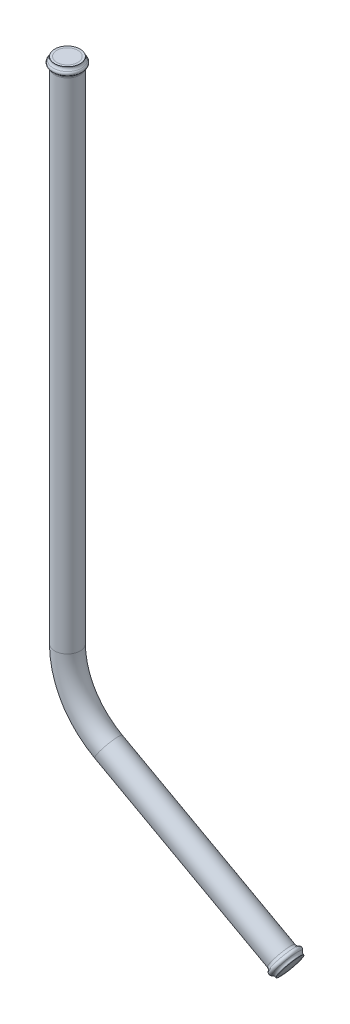
ISO-10303-21;
HEADER;
FILE_DESCRIPTION(('STEP AP214'),'2;1');
FILE_NAME('part.step','',(''),(''),'','','');
FILE_SCHEMA(('AUTOMOTIVE_DESIGN { 1 0 10303 214 1 1 1 1 }'));
ENDSEC;
DATA;
#1=APPLICATION_CONTEXT('core data for automotive mechanical design processes');
#2=APPLICATION_PROTOCOL_DEFINITION('international standard','automotive_design',2000,#1);
#3=PRODUCT_CONTEXT('',#1,'mechanical');
#4=PRODUCT('Part','Part','',(#3));
#5=PRODUCT_RELATED_PRODUCT_CATEGORY('part','',(#4));
#6=PRODUCT_DEFINITION_FORMATION('','',#4);
#7=PRODUCT_DEFINITION_CONTEXT('part definition',#1,'design');
#8=PRODUCT_DEFINITION('design','',#6,#7);
#9=PRODUCT_DEFINITION_SHAPE('','',#8);
#10=(LENGTH_UNIT() NAMED_UNIT(*) SI_UNIT(.MILLI.,.METRE.));
#11=(NAMED_UNIT(*) PLANE_ANGLE_UNIT() SI_UNIT($,.RADIAN.));
#12=(NAMED_UNIT(*) SI_UNIT($,.STERADIAN.) SOLID_ANGLE_UNIT());
#13=UNCERTAINTY_MEASURE_WITH_UNIT(LENGTH_MEASURE(1.E-05),#10,'distance_accuracy_value','');
#14=(GEOMETRIC_REPRESENTATION_CONTEXT(3) GLOBAL_UNCERTAINTY_ASSIGNED_CONTEXT((#13)) GLOBAL_UNIT_ASSIGNED_CONTEXT((#10,
#11,#12)) REPRESENTATION_CONTEXT('',''));
#15=CARTESIAN_POINT('',(0.,0.,0.));
#16=DIRECTION('',(0.,0.,1.));
#17=DIRECTION('',(1.,0.,0.));
#18=AXIS2_PLACEMENT_3D('',#15,#16,#17);
#19=CARTESIAN_POINT('',(407.593134312898,-255.195792787069,307.283767943784));
#20=DIRECTION('',(0.837825093808645,-0.543268611001303,-0.0539289206757398));
#21=DIRECTION('',(0.544060340165077,0.839046093048207,0.));
#22=AXIS2_PLACEMENT_3D('',#19,#20,#21);
#23=CYLINDRICAL_SURFACE('',#22,9.52499999999997);
#24=CARTESIAN_POINT('',(535.011185448498,-337.8171276796,299.082153999384));
#25=DIRECTION('',(0.837825093808641,-0.543268611001309,-0.0539289206757388));
#26=DIRECTION('',(0.544060340165084,0.839046093048203,0.));
#27=AXIS2_PLACEMENT_3D('',#24,#25,#26);
#28=CIRCLE('',#27,9.52499999999997);
#29=CARTESIAN_POINT('',(540.19336018857,-329.825213643316,299.082153999384));
#30=VERTEX_POINT('',#29);
#31=EDGE_CURVE('E13',#30,#30,#28,.T.);
#32=CARTESIAN_POINT('',(535.277678609336,-337.989929103668,299.065000432801));
#33=DIRECTION('',(-0.837825093808644,0.543268611001304,0.0539289206757395));
#34=DIRECTION('',(-0.544060340165078,-0.839046093048206,0.));
#35=AXIS2_PLACEMENT_3D('',#32,#33,#34);
#36=CIRCLE('',#35,9.52499999999997);
#37=CARTESIAN_POINT('',(540.459853349408,-329.998015067384,299.065000432801));
#38=VERTEX_POINT('',#37);
#39=EDGE_CURVE('E118',#38,#38,#36,.T.);
#40=CARTESIAN_POINT('',(540.19336018857,-329.825213643316,299.082153999384));
#41=CARTESIAN_POINT('',(540.196136158996,-329.82701365815,299.081975316399));
#42=CARTESIAN_POINT('',(540.198912129421,-329.828813672984,299.081796633413));
#43=CARTESIAN_POINT('',(540.204464070272,-329.832413702652,299.081439267443));
#44=CARTESIAN_POINT('',(540.207240040697,-329.834213717486,299.081260584458));
#45=CARTESIAN_POINT('',(540.212791981548,-329.837813747154,299.080903218487));
#46=CARTESIAN_POINT('',(540.215567951973,-329.839613761988,299.080724535502));
#47=CARTESIAN_POINT('',(540.221119892824,-329.843213791656,299.080367169531));
#48=CARTESIAN_POINT('',(540.223895863249,-329.845013806491,299.080188486546));
#49=CARTESIAN_POINT('',(540.2294478041,-329.848613836159,299.079831120576));
#50=CARTESIAN_POINT('',(540.232223774526,-329.850413850993,299.07965243759));
#51=CARTESIAN_POINT('',(540.237775715376,-329.854013880661,299.07929507162));
#52=CARTESIAN_POINT('',(540.240551685802,-329.855813895495,299.079116388635));
#53=CARTESIAN_POINT('',(540.246103626653,-329.859413925163,299.078759022664));
#54=CARTESIAN_POINT('',(540.248879597078,-329.861213939997,299.078580339679));
#55=CARTESIAN_POINT('',(540.254431537929,-329.864813969665,299.078222973709));
#56=CARTESIAN_POINT('',(540.257207508354,-329.866613984499,299.078044290723));
#57=CARTESIAN_POINT('',(540.262759449205,-329.870214014167,299.077686924753));
#58=CARTESIAN_POINT('',(540.26553541963,-329.872014029001,299.077508241768));
#59=CARTESIAN_POINT('',(540.271087360481,-329.875614058669,299.077150875797));
#60=CARTESIAN_POINT('',(540.273863330907,-329.877414073503,299.076972192812));
#61=CARTESIAN_POINT('',(540.279415271757,-329.881014103171,299.076614826841));
#62=CARTESIAN_POINT('',(540.282191242183,-329.882814118005,299.076436143856));
#63=CARTESIAN_POINT('',(540.287743183034,-329.886414147673,299.076078777886));
#64=CARTESIAN_POINT('',(540.290519153459,-329.888214162507,299.0759000949));
#65=CARTESIAN_POINT('',(540.29607109431,-329.891814192176,299.07554272893));
#66=CARTESIAN_POINT('',(540.298847064735,-329.89361420701,299.075364045945));
#67=CARTESIAN_POINT('',(540.304399005586,-329.897214236678,299.075006679974));
#68=CARTESIAN_POINT('',(540.307174976011,-329.899014251512,299.074827996989));
#69=CARTESIAN_POINT('',(540.312726916862,-329.90261428118,299.074470631019));
#70=CARTESIAN_POINT('',(540.315502887288,-329.904414296014,299.074291948033));
#71=CARTESIAN_POINT('',(540.321054828138,-329.908014325682,299.073934582063));
#72=CARTESIAN_POINT('',(540.323830798564,-329.909814340516,299.073755899078));
#73=CARTESIAN_POINT('',(540.329382739415,-329.913414370184,299.073398533107));
#74=CARTESIAN_POINT('',(540.33215870984,-329.915214385018,299.073219850122));
#75=CARTESIAN_POINT('',(540.337710650691,-329.918814414686,299.072862484151));
#76=CARTESIAN_POINT('',(540.340486621116,-329.92061442952,299.072683801166));
#77=CARTESIAN_POINT('',(540.346038561967,-329.924214459188,299.072326435196));
#78=CARTESIAN_POINT('',(540.348814532392,-329.926014474022,299.07214775221));
#79=CARTESIAN_POINT('',(540.354366473243,-329.92961450369,299.07179038624));
#80=CARTESIAN_POINT('',(540.357142443669,-329.931414518524,299.071611703255));
#81=CARTESIAN_POINT('',(540.362694384519,-329.935014548192,299.071254337284));
#82=CARTESIAN_POINT('',(540.365470354945,-329.936814563027,299.071075654299));
#83=CARTESIAN_POINT('',(540.371022295795,-329.940414592695,299.070718288329));
#84=CARTESIAN_POINT('',(540.373798266221,-329.942214607529,299.070539605343));
#85=CARTESIAN_POINT('',(540.379350207072,-329.945814637197,299.070182239373));
#86=CARTESIAN_POINT('',(540.382126177497,-329.947614652031,299.070003556388));
#87=CARTESIAN_POINT('',(540.387678118348,-329.951214681699,299.069646190417));
#88=CARTESIAN_POINT('',(540.390454088773,-329.953014696533,299.069467507432));
#89=CARTESIAN_POINT('',(540.396006029624,-329.956614726201,299.069110141461));
#90=CARTESIAN_POINT('',(540.398782000049,-329.958414741035,299.068931458476));
#91=CARTESIAN_POINT('',(540.4043339409,-329.962014770703,299.068574092506));
#92=CARTESIAN_POINT('',(540.407109911326,-329.963814785537,299.06839540952));
#93=CARTESIAN_POINT('',(540.412661852176,-329.967414815205,299.06803804355));
#94=CARTESIAN_POINT('',(540.415437822602,-329.969214830039,299.067859360565));
#95=CARTESIAN_POINT('',(540.420989763453,-329.972814859707,299.067501994594));
#96=CARTESIAN_POINT('',(540.423765733878,-329.974614874541,299.067323311609));
#97=CARTESIAN_POINT('',(540.429317674729,-329.978214904209,299.066965945639));
#98=CARTESIAN_POINT('',(540.432093645154,-329.980014919043,299.066787262653));
#99=CARTESIAN_POINT('',(540.437645586005,-329.983614948712,299.066429896683));
#100=CARTESIAN_POINT('',(540.44042155643,-329.985414963546,299.066251213698));
#101=CARTESIAN_POINT('',(540.445973497281,-329.989014993214,299.065893847727));
#102=CARTESIAN_POINT('',(540.448749467707,-329.990815008048,299.065715164742));
#103=CARTESIAN_POINT('',(540.454301408557,-329.994415037716,299.065357798771));
#104=CARTESIAN_POINT('',(540.457077378983,-329.99621505255,299.065179115786));
#105=CARTESIAN_POINT('',(540.459853349408,-329.998015067384,299.065000432801));
#106=B_SPLINE_CURVE_WITH_KNOTS('',3,(#40,#41,#42,#43,#44,#45,#46,#47,#48,#49,#50,#51,#52,#53,
#54,#55,#56,#57,#58,#59,#60,#61,#62,#63,#64,#65,#66,#67,#68,#69,#70,#71,#72,#73,#74,#75,#76,#77,
#78,#79,#80,#81,#82,#83,#84,#85,#86,#87,#88,#89,#90,#91,#92,#93,#94,#95,#96,#97,#98,#99,#100,
#101,#102,#103,#104,#105),.UNSPECIFIED.,.F.,.F.,(4,2,2,2,2,2,2,2,2,2,2,2,2,2,2,2,2,2,2,2,2,2,2,
2,2,2,2,2,2,2,2,2,4),(0.,0.00993991626390516,0.0198798325276871,0.0298197487914661,
0.0397596650553411,0.0496995813191231,0.0596394975829981,0.0695794138467801,0.0795193301106551,
0.0894592463744643,0.0993991626383393,0.109339078902121,0.119278995165903,0.129218911429778,
0.139158827693653,0.149098743957435,0.159038660221214,0.168978576485089,0.178918492748871,
0.188858409012746,0.198798325276528,0.20873824154031,0.218678157804185,0.228618074068057,
0.238557990331869,0.248497906595651,0.258437822859526,0.268377739123308,0.278317655387183,
0.288257571650962,0.298197487914744,0.308137404178619,0.318077320442525),.UNSPECIFIED.);
#107=EDGE_CURVE('BSEAM73',#30,#38,#106,.T.);
#108=ORIENTED_EDGE('',*,*,#31,.T.);
#109=ORIENTED_EDGE('',*,*,#39,.T.);
#110=ORIENTED_EDGE('',*,*,#107,.T.);
#111=ORIENTED_EDGE('',*,*,#107,.F.);
#112=EDGE_LOOP('',(#108,#110,#109,#111));
#113=FACE_BOUND('',#112,.T.);
#114=ADVANCED_FACE('F73',(#113),#23,.T.);
#115=CARTESIAN_POINT('',(378.65058663225,179.1162,309.14673477249));
#116=DIRECTION('',(0.,-1.,0.));
#117=DIRECTION('',(0.,0.,-1.));
#118=AXIS2_PLACEMENT_3D('',#115,#116,#117);
#119=CYLINDRICAL_SURFACE('',#118,9.52499999999997);
#120=CARTESIAN_POINT('',(378.65058663225,178.798122679556,309.14673477249));
#121=DIRECTION('',(0.,1.,0.));
#122=DIRECTION('',(0.,0.,1.));
#123=AXIS2_PLACEMENT_3D('',#120,#121,#122);
#124=CIRCLE('',#123,9.52499999999997);
#125=CARTESIAN_POINT('',(378.65058663225,178.798122679556,318.67173477249));
#126=VERTEX_POINT('',#125);
#127=EDGE_CURVE('E102',#126,#126,#124,.T.);
#128=ORIENTED_EDGE('',*,*,#127,.T.);
#129=EDGE_LOOP('',(#128));
#130=FACE_BOUND('',#129,.T.);
#131=CARTESIAN_POINT('',(378.65058663225,179.1162,309.14673477249));
#132=DIRECTION('',(0.,1.,0.));
#133=DIRECTION('',(-0.999570072305478,0.,0.0293201390041424));
#134=AXIS2_PLACEMENT_3D('',#131,#132,#133);
#135=CIRCLE('',#134,9.52499999999997);
#136=CARTESIAN_POINT('',(369.129681693541,179.1162,309.426009096505));
#137=VERTEX_POINT('',#136);
#138=EDGE_CURVE('E114',#137,#137,#135,.T.);
#139=ORIENTED_EDGE('',*,*,#138,.F.);
#140=EDGE_LOOP('',(#139));
#141=FACE_BOUND('',#140,.T.);
#142=ADVANCED_FACE('F144',(#130,#141),#119,.T.);
#143=CARTESIAN_POINT('',(378.650586632251,182.9262,309.14673477249));
#144=DIRECTION('',(0.,-1.,0.));
#145=DIRECTION('',(0.,0.,-1.));
#146=AXIS2_PLACEMENT_3D('',#143,#144,#145);
#147=CYLINDRICAL_SURFACE('',#146,7.85000000000002);
#148=CARTESIAN_POINT('',(378.650586632251,179.1162,309.14673477249));
#149=DIRECTION('',(0.,1.,0.));
#150=DIRECTION('',(0.,0.,1.));
#151=AXIS2_PLACEMENT_3D('',#148,#149,#150);
#152=CIRCLE('',#151,7.85000000000002);
#153=CARTESIAN_POINT('',(378.650586632251,179.1162,316.99673477249));
#154=VERTEX_POINT('',#153);
#155=EDGE_CURVE('E115',#154,#154,#152,.T.);
#156=ORIENTED_EDGE('',*,*,#155,.T.);
#157=EDGE_LOOP('',(#156));
#158=FACE_BOUND('',#157,.T.);
#159=CARTESIAN_POINT('',(378.650586632251,-201.8838,309.14673477249));
#160=DIRECTION('',(0.,1.,0.));
#161=DIRECTION('',(-0.999570072305477,0.,0.0293201390041424));
#162=AXIS2_PLACEMENT_3D('',#159,#160,#161);
#163=CIRCLE('',#162,7.85000000000002);
#164=CARTESIAN_POINT('',(370.816798364303,-201.8838,309.650978139292));
#165=VERTEX_POINT('',#164);
#166=EDGE_CURVE('E105',#165,#165,#163,.T.);
#167=ORIENTED_EDGE('',*,*,#166,.F.);
#168=EDGE_LOOP('',(#167));
#169=FACE_BOUND('',#168,.T.);
#170=ADVANCED_FACE('F152',(#158,#169),#147,.F.);
#171=CARTESIAN_POINT('',(407.593134312899,-255.195792787065,307.283767943786));
#172=DIRECTION('',(0.837825093808645,-0.543268611001303,-0.0539289206757397));
#173=DIRECTION('',(0.544060340165078,0.839046093048207,0.));
#174=AXIS2_PLACEMENT_3D('',#171,#172,#173);
#175=CYLINDRICAL_SURFACE('',#174,7.85000000000002);
#176=CARTESIAN_POINT('',(407.593134312899,-255.195792787065,307.283767943786));
#177=DIRECTION('',(-0.837825093808644,0.543268611001304,0.0539289206757395));
#178=DIRECTION('',(-0.544060340165078,-0.839046093048206,0.));
#179=AXIS2_PLACEMENT_3D('',#176,#177,#178);
#180=CIRCLE('',#179,7.85000000000002);
#181=CARTESIAN_POINT('',(403.337283041691,-261.786330478068,307.557707537275));
#182=VERTEX_POINT('',#181);
#183=EDGE_CURVE('E108',#182,#182,#180,.T.);
#184=ORIENTED_EDGE('',*,*,#183,.T.);
#185=EDGE_LOOP('',(#184));
#186=FACE_BOUND('',#185,.T.);
#187=CARTESIAN_POINT('',(535.277678609338,-337.989929103665,299.065000432803));
#188=DIRECTION('',(-0.837825093808644,0.543268611001304,0.0539289206757395));
#189=DIRECTION('',(-0.544060340165078,-0.839046093048206,0.));
#190=AXIS2_PLACEMENT_3D('',#187,#188,#189);
#191=CIRCLE('',#190,7.85000000000002);
#192=CARTESIAN_POINT('',(531.006804939042,-344.576440934093,299.065000432803));
#193=VERTEX_POINT('',#192);
#194=EDGE_CURVE('E111',#193,#193,#191,.T.);
#195=ORIENTED_EDGE('',*,*,#194,.F.);
#196=EDGE_LOOP('',(#195));
#197=FACE_BOUND('',#196,.T.);
#198=ADVANCED_FACE('F163',(#186,#197),#175,.F.);
#199=CARTESIAN_POINT('',(442.019447143675,-201.8838,305.067823461422));
#200=DIRECTION('',(0.0642348237963485,0.,0.997934811203543));
#201=DIRECTION('',(0.997934811203544,0.,-0.0642348237963486));
#202=AXIS2_PLACEMENT_3D('',#199,#200,#201);
#203=TOROIDAL_SURFACE('',#202,63.4999999999999,7.85000000000002);
#204=CARTESIAN_POINT('',(442.019447143675,-201.8838,305.067823461422));
#205=DIRECTION('',(0.0642348237963485,0.,0.997934811203543));
#206=DIRECTION('',(0.997934811203544,0.,-0.0642348237963486));
#207=AXIS2_PLACEMENT_3D('',#204,#205,#206);
#208=CIRCLE('',#207,71.3499999999999);
#209=EDGE_CURVE('',#165,#182,#208,.T.);
#210=ORIENTED_EDGE('',*,*,#166,.T.);
#211=ORIENTED_EDGE('',*,*,#183,.F.);
#212=ORIENTED_EDGE('',*,*,#209,.T.);
#213=ORIENTED_EDGE('',*,*,#209,.F.);
#214=EDGE_LOOP('',(#210,#212,#211,#213));
#215=FACE_BOUND('',#214,.T.);
#216=ADVANCED_FACE('F158',(#215),#203,.F.);
#217=CARTESIAN_POINT('',(535.277678609336,-337.989929103668,299.065000432801));
#218=DIRECTION('',(-0.837825093808644,0.543268611001304,0.0539289206757395));
#219=DIRECTION('',(-0.544060340165078,-0.839046093048206,0.));
#220=AXIS2_PLACEMENT_3D('',#217,#218,#219);
#221=PLANE('',#220);
#222=ORIENTED_EDGE('',*,*,#194,.T.);
#223=EDGE_LOOP('',(#222));
#224=FACE_BOUND('',#223,.T.);
#225=ORIENTED_EDGE('',*,*,#39,.F.);
#226=EDGE_LOOP('',(#225));
#227=FACE_BOUND('',#226,.T.);
#228=ADVANCED_FACE('F145',(#224,#227),#221,.F.);
#229=CARTESIAN_POINT('',(442.019447143675,-201.8838,305.067823461422));
#230=DIRECTION('',(0.0642348237963485,0.,0.997934811203543));
#231=DIRECTION('',(0.997934811203544,0.,-0.0642348237963486));
#232=AXIS2_PLACEMENT_3D('',#229,#230,#231);
#233=TOROIDAL_SURFACE('',#232,63.5,9.52499999999997);
#234=CARTESIAN_POINT('',(378.65058663225,-201.8838,309.14673477249));
#235=DIRECTION('',(0.,1.,0.));
#236=DIRECTION('',(-0.999570072305478,0.,0.0293201390041424));
#237=AXIS2_PLACEMENT_3D('',#234,#235,#236);
#238=CIRCLE('',#237,9.52499999999997);
#239=CARTESIAN_POINT('',(369.145257555537,-201.8838,309.758571469151));
#240=VERTEX_POINT('',#239);
#241=EDGE_CURVE('E121',#240,#240,#238,.T.);
#242=CARTESIAN_POINT('',(407.593134312899,-255.195792787066,307.283767943785));
#243=DIRECTION('',(-0.837825093808644,0.543268611001304,0.0539289206757395));
#244=DIRECTION('',(-0.544060340165078,-0.839046093048206,0.));
#245=AXIS2_PLACEMENT_3D('',#242,#243,#244);
#246=CIRCLE('',#245,9.52499999999997);
#247=CARTESIAN_POINT('',(402.429187388281,-263.192591705129,307.61615961614));
#248=VERTEX_POINT('',#247);
#249=EDGE_CURVE('E124',#248,#248,#246,.T.);
#250=CARTESIAN_POINT('',(442.019447143675,-201.8838,305.067823461422));
#251=DIRECTION('',(0.0642348237963485,0.,0.997934811203543));
#252=DIRECTION('',(0.997934811203544,0.,-0.0642348237963486));
#253=AXIS2_PLACEMENT_3D('',#250,#251,#252);
#254=CIRCLE('',#253,73.0249999999999);
#255=EDGE_CURVE('',#240,#248,#254,.T.);
#256=ORIENTED_EDGE('',*,*,#241,.F.);
#257=ORIENTED_EDGE('',*,*,#249,.T.);
#258=ORIENTED_EDGE('',*,*,#255,.T.);
#259=ORIENTED_EDGE('',*,*,#255,.F.);
#260=EDGE_LOOP('',(#256,#258,#257,#259));
#261=FACE_BOUND('',#260,.T.);
#262=ADVANCED_FACE('F130',(#261),#233,.T.);
#263=CARTESIAN_POINT('',(529.159944555353,-334.023023711906,299.458785241767));
#264=DIRECTION('',(0.837825093808641,-0.543268611001309,-0.0539289206757388));
#265=DIRECTION('',(0.544060340165084,0.839046093048203,0.));
#266=AXIS2_PLACEMENT_3D('',#263,#264,#265);
#267=CIRCLE('',#266,9.52499999999997);
#268=CARTESIAN_POINT('',(534.342119295425,-326.031109675622,299.458785241767));
#269=VERTEX_POINT('',#268);
#270=EDGE_CURVE('E80',#269,#269,#267,.F.);
#271=ORIENTED_EDGE('',*,*,#270,.T.);
#272=EDGE_LOOP('',(#271));
#273=FACE_BOUND('',#272,.T.);
#274=ORIENTED_EDGE('',*,*,#249,.F.);
#275=EDGE_LOOP('',(#274));
#276=FACE_BOUND('',#275,.T.);
#277=ADVANCED_FACE('F133',(#273,#276),#23,.T.);
#278=CARTESIAN_POINT('',(378.65058663225,171.814277320444,309.14673477249));
#279=DIRECTION('',(0.,1.,0.));
#280=DIRECTION('',(0.,0.,1.));
#281=AXIS2_PLACEMENT_3D('',#278,#279,#280);
#282=CIRCLE('',#281,9.52499999999997);
#283=CARTESIAN_POINT('',(378.65058663225,171.814277320444,318.67173477249));
#284=VERTEX_POINT('',#283);
#285=EDGE_CURVE('E93',#284,#284,#282,.F.);
#286=ORIENTED_EDGE('',*,*,#285,.T.);
#287=EDGE_LOOP('',(#286));
#288=FACE_BOUND('',#287,.T.);
#289=ORIENTED_EDGE('',*,*,#241,.T.);
#290=EDGE_LOOP('',(#289));
#291=FACE_BOUND('',#290,.T.);
#292=ADVANCED_FACE('F135',(#288,#291),#119,.T.);
#293=CARTESIAN_POINT('',(378.65058663225,179.1162,309.14673477249));
#294=DIRECTION('',(0.,1.,0.));
#295=DIRECTION('',(-0.999570072305478,0.,0.0293201390041424));
#296=AXIS2_PLACEMENT_3D('',#293,#294,#295);
#297=PLANE('',#296);
#298=ORIENTED_EDGE('',*,*,#155,.F.);
#299=EDGE_LOOP('',(#298));
#300=FACE_BOUND('',#299,.T.);
#301=ORIENTED_EDGE('',*,*,#138,.T.);
#302=EDGE_LOOP('',(#301));
#303=FACE_BOUND('',#302,.T.);
#304=ADVANCED_FACE('F141',(#300,#303),#297,.T.);
#305=CARTESIAN_POINT('',(378.650586632251,175.3062,309.14673477249));
#306=DIRECTION('',(0.,1.,0.));
#307=DIRECTION('',(0.,0.,1.));
#308=AXIS2_PLACEMENT_3D('',#305,#306,#307);
#309=TOROIDAL_SURFACE('',#308,9.5249999999999,1.778);
#310=CARTESIAN_POINT('',(378.650586632251,176.744050515111,309.14673477249));
#311=DIRECTION('',(0.,-1.,0.));
#312=DIRECTION('',(0.,0.,-1.));
#313=AXIS2_PLACEMENT_3D('',#310,#311,#312);
#314=CIRCLE('',#313,10.5708823529411);
#315=CARTESIAN_POINT('',(378.650586632251,176.744050515111,298.575852419549));
#316=VERTEX_POINT('',#315);
#317=EDGE_CURVE('E96',#316,#316,#314,.T.);
#318=ORIENTED_EDGE('',*,*,#317,.T.);
#319=EDGE_LOOP('',(#318));
#320=FACE_BOUND('',#319,.T.);
#321=CARTESIAN_POINT('',(378.650586632251,173.868349484889,309.14673477249));
#322=DIRECTION('',(0.,1.,0.));
#323=DIRECTION('',(0.,0.,1.));
#324=AXIS2_PLACEMENT_3D('',#321,#322,#323);
#325=CIRCLE('',#324,10.5708823529411);
#326=CARTESIAN_POINT('',(378.650586632251,173.868349484889,319.717617125431));
#327=VERTEX_POINT('',#326);
#328=EDGE_CURVE('E99',#327,#327,#325,.T.);
#329=ORIENTED_EDGE('',*,*,#328,.T.);
#330=EDGE_LOOP('',(#329));
#331=FACE_BOUND('',#330,.T.);
#332=ADVANCED_FACE('F166',(#320,#331),#309,.T.);
#333=CARTESIAN_POINT('',(532.085565001925,-335.920075695754,299.270469620575));
#334=DIRECTION('',(0.837825093808637,-0.543268611001315,-0.0539289206757379));
#335=DIRECTION('',(0.54406034016509,0.839046093048199,0.));
#336=AXIS2_PLACEMENT_3D('',#333,#334,#335);
#337=TOROIDAL_SURFACE('',#336,9.52499999999999,1.77799999999995);
#338=CARTESIAN_POINT('',(530.880897759218,-335.138936643582,299.348011346948));
#339=DIRECTION('',(0.837825093808641,-0.543268611001309,-0.0539289206757388));
#340=DIRECTION('',(0.544060340165084,0.839046093048203,0.));
#341=AXIS2_PLACEMENT_3D('',#338,#339,#340);
#342=CIRCLE('',#341,10.5708823529407);
#343=CARTESIAN_POINT('',(536.632095608004,-326.269479105275,299.348011346948));
#344=VERTEX_POINT('',#343);
#345=EDGE_CURVE('E84',#344,#344,#342,.T.);
#346=ORIENTED_EDGE('',*,*,#345,.T.);
#347=EDGE_LOOP('',(#346));
#348=FACE_BOUND('',#347,.T.);
#349=CARTESIAN_POINT('',(533.290232244631,-336.701214747926,299.192927894202));
#350=DIRECTION('',(-0.837825093808641,0.543268611001309,0.0539289206757388));
#351=DIRECTION('',(-0.544060340165084,-0.839046093048203,0.));
#352=AXIS2_PLACEMENT_3D('',#349,#350,#351);
#353=CIRCLE('',#352,10.5708823529407);
#354=CARTESIAN_POINT('',(527.539034395845,-345.570672286234,299.192927894202));
#355=VERTEX_POINT('',#354);
#356=EDGE_CURVE('E88',#355,#355,#353,.T.);
#357=ORIENTED_EDGE('',*,*,#356,.T.);
#358=EDGE_LOOP('',(#357));
#359=FACE_BOUND('',#358,.T.);
#360=ADVANCED_FACE('F173',(#348,#359),#337,.T.);
#361=CARTESIAN_POINT('',(378.65058663225,178.798122679556,309.14673477249));
#362=DIRECTION('',(0.,1.,0.));
#363=DIRECTION('',(0.,0.,1.));
#364=AXIS2_PLACEMENT_3D('',#361,#362,#363);
#365=TOROIDAL_SURFACE('',#364,12.0649999999999,2.54);
#366=ORIENTED_EDGE('',*,*,#317,.F.);
#367=EDGE_LOOP('',(#366));
#368=FACE_BOUND('',#367,.T.);
#369=ORIENTED_EDGE('',*,*,#127,.F.);
#370=EDGE_LOOP('',(#369));
#371=FACE_BOUND('',#370,.T.);
#372=ADVANCED_FACE('F190',(#368,#371),#365,.F.);
#373=CARTESIAN_POINT('',(378.65058663225,171.814277320444,309.14673477249));
#374=DIRECTION('',(0.,1.,0.));
#375=DIRECTION('',(0.,0.,1.));
#376=AXIS2_PLACEMENT_3D('',#373,#374,#375);
#377=TOROIDAL_SURFACE('',#376,12.0649999999999,2.54);
#378=ORIENTED_EDGE('',*,*,#285,.F.);
#379=EDGE_LOOP('',(#378));
#380=FACE_BOUND('',#379,.T.);
#381=ORIENTED_EDGE('',*,*,#328,.F.);
#382=EDGE_LOOP('',(#381));
#383=FACE_BOUND('',#382,.T.);
#384=ADVANCED_FACE('F194',(#380,#383),#377,.F.);
#385=CARTESIAN_POINT('',(529.159944555352,-334.023023711907,299.458785241767));
#386=DIRECTION('',(0.837825093808641,-0.543268611001309,-0.0539289206757388));
#387=DIRECTION('',(0.544060340165084,0.839046093048203,0.));
#388=AXIS2_PLACEMENT_3D('',#385,#386,#387);
#389=TOROIDAL_SURFACE('',#388,12.0649999999989,2.54);
#390=ORIENTED_EDGE('',*,*,#270,.F.);
#391=EDGE_LOOP('',(#390));
#392=FACE_BOUND('',#391,.T.);
#393=ORIENTED_EDGE('',*,*,#345,.F.);
#394=EDGE_LOOP('',(#393));
#395=FACE_BOUND('',#394,.T.);
#396=ADVANCED_FACE('F197',(#392,#395),#389,.F.);
#397=CARTESIAN_POINT('',(535.011185448497,-337.817127679601,299.082153999384));
#398=DIRECTION('',(0.837825093808641,-0.543268611001309,-0.0539289206757388));
#399=DIRECTION('',(0.544060340165084,0.839046093048203,0.));
#400=AXIS2_PLACEMENT_3D('',#397,#398,#399);
#401=TOROIDAL_SURFACE('',#400,12.0649999999989,2.54);
#402=ORIENTED_EDGE('',*,*,#356,.F.);
#403=EDGE_LOOP('',(#402));
#404=FACE_BOUND('',#403,.T.);
#405=ORIENTED_EDGE('',*,*,#31,.F.);
#406=EDGE_LOOP('',(#405));
#407=FACE_BOUND('',#406,.T.);
#408=ADVANCED_FACE('F75',(#404,#407),#401,.F.);
#409=CLOSED_SHELL('',(#114,#142,#170,#198,#216,#228,#262,#277,#292,#304,#332,#360,#372,#384,
#396,#408));
#410=MANIFOLD_SOLID_BREP('B2',#409);
#411=CARTESIAN_POINT('',(378.650586632251,182.9262,309.14673477249));
#412=DIRECTION('',(0.,-1.,0.));
#413=DIRECTION('',(0.,0.,-1.));
#414=AXIS2_PLACEMENT_3D('',#411,#412,#413);
#415=CYLINDRICAL_SURFACE('',#414,7.85000000000002);
#416=CARTESIAN_POINT('',(378.650586632251,-201.8838,309.14673477249));
#417=DIRECTION('',(0.,1.,0.));
#418=DIRECTION('',(-0.999570072305477,0.,0.0293201390041424));
#419=AXIS2_PLACEMENT_3D('',#416,#417,#418);
#420=CIRCLE('',#419,7.85000000000002);
#421=CARTESIAN_POINT('',(370.816798364303,-201.8838,309.650978139292));
#422=VERTEX_POINT('',#421);
#423=EDGE_CURVE('E338',#422,#422,#420,.T.);
#424=ORIENTED_EDGE('',*,*,#423,.T.);
#425=EDGE_LOOP('',(#424));
#426=FACE_BOUND('',#425,.T.);
#427=CARTESIAN_POINT('',(378.650586632251,179.1162,309.14673477249));
#428=DIRECTION('',(0.,1.,0.));
#429=DIRECTION('',(0.,0.,1.));
#430=AXIS2_PLACEMENT_3D('',#427,#428,#429);
#431=CIRCLE('',#430,7.85000000000002);
#432=CARTESIAN_POINT('',(378.650586632251,179.1162,316.99673477249));
#433=VERTEX_POINT('',#432);
#434=EDGE_CURVE('E72',#433,#433,#431,.T.);
#435=ORIENTED_EDGE('',*,*,#434,.F.);
#436=EDGE_LOOP('',(#435));
#437=FACE_BOUND('',#436,.T.);
#438=ADVANCED_FACE('F334',(#426,#437),#415,.T.);
#439=CARTESIAN_POINT('',(407.593134312899,-255.195792787065,307.283767943786));
#440=DIRECTION('',(0.837825093808645,-0.543268611001303,-0.0539289206757397));
#441=DIRECTION('',(0.544060340165078,0.839046093048207,0.));
#442=AXIS2_PLACEMENT_3D('',#439,#440,#441);
#443=CYLINDRICAL_SURFACE('',#442,7.85000000000002);
#444=CARTESIAN_POINT('',(535.277678609338,-337.989929103665,299.065000432803));
#445=DIRECTION('',(-0.837825093808644,0.543268611001304,0.0539289206757395));
#446=DIRECTION('',(-0.544060340165078,-0.839046093048206,0.));
#447=AXIS2_PLACEMENT_3D('',#444,#445,#446);
#448=CIRCLE('',#447,7.85000000000002);
#449=CARTESIAN_POINT('',(531.006804939042,-344.576440934093,299.065000432803));
#450=VERTEX_POINT('',#449);
#451=EDGE_CURVE('E342',#450,#450,#448,.T.);
#452=ORIENTED_EDGE('',*,*,#451,.T.);
#453=EDGE_LOOP('',(#452));
#454=FACE_BOUND('',#453,.T.);
#455=CARTESIAN_POINT('',(407.593134312899,-255.195792787065,307.283767943786));
#456=DIRECTION('',(-0.837825093808644,0.543268611001304,0.0539289206757395));
#457=DIRECTION('',(-0.544060340165078,-0.839046093048206,0.));
#458=AXIS2_PLACEMENT_3D('',#455,#456,#457);
#459=CIRCLE('',#458,7.85000000000002);
#460=CARTESIAN_POINT('',(403.337283041691,-261.786330478068,307.557707537275));
#461=VERTEX_POINT('',#460);
#462=EDGE_CURVE('E347',#461,#461,#459,.T.);
#463=ORIENTED_EDGE('',*,*,#462,.F.);
#464=EDGE_LOOP('',(#463));
#465=FACE_BOUND('',#464,.T.);
#466=ADVANCED_FACE('F359',(#454,#465),#443,.T.);
#467=CARTESIAN_POINT('',(442.019447143675,-201.8838,305.067823461422));
#468=DIRECTION('',(0.0642348237963485,0.,0.997934811203543));
#469=DIRECTION('',(0.997934811203544,0.,-0.0642348237963486));
#470=AXIS2_PLACEMENT_3D('',#467,#468,#469);
#471=TOROIDAL_SURFACE('',#470,63.4999999999999,7.85000000000002);
#472=CARTESIAN_POINT('',(442.019447143675,-201.8838,305.067823461422));
#473=DIRECTION('',(0.0642348237963485,0.,0.997934811203543));
#474=DIRECTION('',(0.997934811203544,0.,-0.0642348237963486));
#475=AXIS2_PLACEMENT_3D('',#472,#473,#474);
#476=CIRCLE('',#475,71.3499999999999);
#477=EDGE_CURVE('',#422,#461,#476,.T.);
#478=ORIENTED_EDGE('',*,*,#423,.F.);
#479=ORIENTED_EDGE('',*,*,#462,.T.);
#480=ORIENTED_EDGE('',*,*,#477,.T.);
#481=ORIENTED_EDGE('',*,*,#477,.F.);
#482=EDGE_LOOP('',(#478,#480,#479,#481));
#483=FACE_BOUND('',#482,.T.);
#484=ADVANCED_FACE('F357',(#483),#471,.T.);
#485=CARTESIAN_POINT('',(516.066860340143,-334.631808563169,-33.2180654176228));
#486=DIRECTION('',(0.83782509380864,-0.54326861100131,-0.053928920675742));
#487=DIRECTION('',(0.544060340165084,0.839046093048202,0.));
#488=AXIS2_PLACEMENT_3D('',#485,#486,#487);
#489=PLANE('',#488);
#490=ORIENTED_EDGE('',*,*,#451,.F.);
#491=EDGE_LOOP('',(#490));
#492=FACE_BOUND('',#491,.T.);
#493=ADVANCED_FACE('F336',(#492),#489,.T.);
#494=CARTESIAN_POINT('',(1.02963871413328E-13,179.1162,-1.04400937894766E-13));
#495=DIRECTION('',(0.,1.,0.));
#496=DIRECTION('',(-1.,0.,0.));
#497=AXIS2_PLACEMENT_3D('',#494,#495,#496);
#498=PLANE('',#497);
#499=ORIENTED_EDGE('',*,*,#434,.T.);
#500=EDGE_LOOP('',(#499));
#501=FACE_BOUND('',#500,.T.);
#502=ADVANCED_FACE('F361',(#501),#498,.T.);
#503=CLOSED_SHELL('',(#438,#466,#484,#493,#502));
#504=MANIFOLD_SOLID_BREP('B8',#503);
#505=ADVANCED_BREP_SHAPE_REPRESENTATION('',(#18,#410,#504),#14);
#506=SHAPE_DEFINITION_REPRESENTATION(#9,#505);
ENDSEC;
END-ISO-10303-21;
